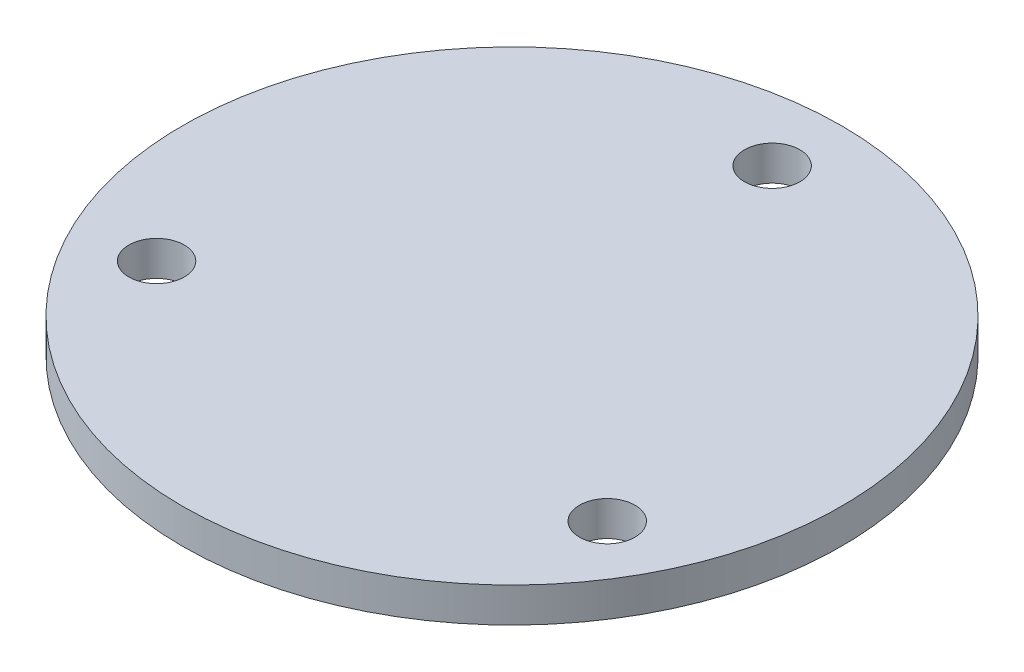
ISO-10303-21;
HEADER;
FILE_DESCRIPTION(('STEP AP214'),'2;1');
FILE_NAME('part.step','',(''),(''),'','','');
FILE_SCHEMA(('AUTOMOTIVE_DESIGN { 1 0 10303 214 1 1 1 1 }'));
ENDSEC;
DATA;
#1=APPLICATION_CONTEXT('core data for automotive mechanical design processes');
#2=APPLICATION_PROTOCOL_DEFINITION('international standard','automotive_design',2000,#1);
#3=PRODUCT_CONTEXT('',#1,'mechanical');
#4=PRODUCT('Part','Part','',(#3));
#5=PRODUCT_RELATED_PRODUCT_CATEGORY('part','',(#4));
#6=PRODUCT_DEFINITION_FORMATION('','',#4);
#7=PRODUCT_DEFINITION_CONTEXT('part definition',#1,'design');
#8=PRODUCT_DEFINITION('design','',#6,#7);
#9=PRODUCT_DEFINITION_SHAPE('','',#8);
#10=(LENGTH_UNIT() NAMED_UNIT(*) SI_UNIT(.MILLI.,.METRE.));
#11=(NAMED_UNIT(*) PLANE_ANGLE_UNIT() SI_UNIT($,.RADIAN.));
#12=(NAMED_UNIT(*) SI_UNIT($,.STERADIAN.) SOLID_ANGLE_UNIT());
#13=UNCERTAINTY_MEASURE_WITH_UNIT(LENGTH_MEASURE(1.E-05),#10,'distance_accuracy_value','');
#14=(GEOMETRIC_REPRESENTATION_CONTEXT(3) GLOBAL_UNCERTAINTY_ASSIGNED_CONTEXT((#13)) GLOBAL_UNIT_ASSIGNED_CONTEXT((#10,
#11,#12)) REPRESENTATION_CONTEXT('',''));
#15=CARTESIAN_POINT('',(0.,0.,0.));
#16=DIRECTION('',(0.,0.,1.));
#17=DIRECTION('',(1.,0.,0.));
#18=AXIS2_PLACEMENT_3D('',#15,#16,#17);
#19=CARTESIAN_POINT('',(0.,2.,0.));
#20=DIRECTION('',(0.,1.,0.));
#21=DIRECTION('',(0.,0.,1.));
#22=AXIS2_PLACEMENT_3D('',#19,#20,#21);
#23=PLANE('',#22);
#24=CARTESIAN_POINT('',(12.9903810567675,2.,7.49999999999945));
#25=DIRECTION('',(0.,1.,0.));
#26=DIRECTION('',(0.,0.,1.));
#27=AXIS2_PLACEMENT_3D('',#24,#25,#26);
#28=CIRCLE('',#27,1.60000000000082);
#29=CARTESIAN_POINT('',(12.9903810567675,2.,9.10000000000027));
#30=VERTEX_POINT('',#29);
#31=EDGE_CURVE('E56',#30,#30,#28,.T.);
#32=ORIENTED_EDGE('',*,*,#31,.F.);
#33=EDGE_LOOP('',(#32));
#34=FACE_BOUND('',#33,.T.);
#35=CARTESIAN_POINT('',(0.,2.,0.));
#36=DIRECTION('',(0.,1.,0.));
#37=DIRECTION('',(0.,0.,1.));
#38=AXIS2_PLACEMENT_3D('',#35,#36,#37);
#39=CIRCLE('',#38,19.);
#40=CARTESIAN_POINT('',(0.,2.,19.));
#41=VERTEX_POINT('',#40);
#42=EDGE_CURVE('E10',#41,#41,#39,.T.);
#43=ORIENTED_EDGE('',*,*,#42,.T.);
#44=EDGE_LOOP('',(#43));
#45=FACE_BOUND('',#44,.T.);
#46=CARTESIAN_POINT('',(0.,2.,-15.));
#47=DIRECTION('',(0.,1.,0.));
#48=DIRECTION('',(0.,0.,1.));
#49=AXIS2_PLACEMENT_3D('',#46,#47,#48);
#50=CIRCLE('',#49,1.6);
#51=CARTESIAN_POINT('',(0.,2.,-13.4));
#52=VERTEX_POINT('',#51);
#53=EDGE_CURVE('E50',#52,#52,#50,.T.);
#54=ORIENTED_EDGE('',*,*,#53,.F.);
#55=EDGE_LOOP('',(#54));
#56=FACE_BOUND('',#55,.T.);
#57=CARTESIAN_POINT('',(-12.9903810567656,2.,7.50000000000056));
#58=DIRECTION('',(0.,1.,0.));
#59=DIRECTION('',(0.,0.,1.));
#60=AXIS2_PLACEMENT_3D('',#57,#58,#59);
#61=CIRCLE('',#60,1.60000000000122);
#62=CARTESIAN_POINT('',(-12.9903810567656,2.,9.10000000000177));
#63=VERTEX_POINT('',#62);
#64=EDGE_CURVE('E64',#63,#63,#61,.T.);
#65=ORIENTED_EDGE('',*,*,#64,.F.);
#66=EDGE_LOOP('',(#65));
#67=FACE_BOUND('',#66,.T.);
#68=ADVANCED_FACE('F37',(#34,#45,#56,#67),#23,.T.);
#69=CARTESIAN_POINT('',(0.,0.,0.));
#70=DIRECTION('',(0.,1.,0.));
#71=DIRECTION('',(0.,0.,1.));
#72=AXIS2_PLACEMENT_3D('',#69,#70,#71);
#73=PLANE('',#72);
#74=CARTESIAN_POINT('',(0.,0.,0.));
#75=DIRECTION('',(0.,1.,0.));
#76=DIRECTION('',(0.,0.,1.));
#77=AXIS2_PLACEMENT_3D('',#74,#75,#76);
#78=CIRCLE('',#77,19.);
#79=CARTESIAN_POINT('',(0.,0.,19.));
#80=VERTEX_POINT('',#79);
#81=EDGE_CURVE('E41',#80,#80,#78,.T.);
#82=ORIENTED_EDGE('',*,*,#81,.F.);
#83=EDGE_LOOP('',(#82));
#84=FACE_BOUND('',#83,.T.);
#85=CARTESIAN_POINT('',(0.,0.,-15.));
#86=DIRECTION('',(0.,1.,0.));
#87=DIRECTION('',(0.,0.,1.));
#88=AXIS2_PLACEMENT_3D('',#85,#86,#87);
#89=CIRCLE('',#88,1.6);
#90=CARTESIAN_POINT('',(0.,0.,-13.4));
#91=VERTEX_POINT('',#90);
#92=EDGE_CURVE('E52',#91,#91,#89,.T.);
#93=ORIENTED_EDGE('',*,*,#92,.T.);
#94=EDGE_LOOP('',(#93));
#95=FACE_BOUND('',#94,.T.);
#96=CARTESIAN_POINT('',(12.9903810567675,0.,7.49999999999945));
#97=DIRECTION('',(0.,1.,0.));
#98=DIRECTION('',(0.,0.,1.));
#99=AXIS2_PLACEMENT_3D('',#96,#97,#98);
#100=CIRCLE('',#99,1.60000000000082);
#101=CARTESIAN_POINT('',(12.9903810567675,0.,9.10000000000027));
#102=VERTEX_POINT('',#101);
#103=EDGE_CURVE('E60',#102,#102,#100,.T.);
#104=ORIENTED_EDGE('',*,*,#103,.T.);
#105=EDGE_LOOP('',(#104));
#106=FACE_BOUND('',#105,.T.);
#107=CARTESIAN_POINT('',(-12.9903810567656,0.,7.50000000000056));
#108=DIRECTION('',(0.,1.,0.));
#109=DIRECTION('',(0.,0.,1.));
#110=AXIS2_PLACEMENT_3D('',#107,#108,#109);
#111=CIRCLE('',#110,1.60000000000122);
#112=CARTESIAN_POINT('',(-12.9903810567656,0.,9.10000000000177));
#113=VERTEX_POINT('',#112);
#114=EDGE_CURVE('E68',#113,#113,#111,.T.);
#115=ORIENTED_EDGE('',*,*,#114,.T.);
#116=EDGE_LOOP('',(#115));
#117=FACE_BOUND('',#116,.T.);
#118=ADVANCED_FACE('F80',(#84,#95,#106,#117),#73,.F.);
#119=CARTESIAN_POINT('',(0.,2.,0.));
#120=DIRECTION('',(0.,-1.,0.));
#121=DIRECTION('',(0.,0.,-1.));
#122=AXIS2_PLACEMENT_3D('',#119,#120,#121);
#123=CYLINDRICAL_SURFACE('',#122,19.);
#124=ORIENTED_EDGE('',*,*,#42,.F.);
#125=EDGE_LOOP('',(#124));
#126=FACE_BOUND('',#125,.T.);
#127=ORIENTED_EDGE('',*,*,#81,.T.);
#128=EDGE_LOOP('',(#127));
#129=FACE_BOUND('',#128,.T.);
#130=ADVANCED_FACE('F39',(#126,#129),#123,.T.);
#131=CARTESIAN_POINT('',(0.,2.,-15.));
#132=DIRECTION('',(0.,-1.,0.));
#133=DIRECTION('',(0.,0.,-1.));
#134=AXIS2_PLACEMENT_3D('',#131,#132,#133);
#135=CYLINDRICAL_SURFACE('',#134,1.6);
#136=ORIENTED_EDGE('',*,*,#53,.T.);
#137=EDGE_LOOP('',(#136));
#138=FACE_BOUND('',#137,.T.);
#139=ORIENTED_EDGE('',*,*,#92,.F.);
#140=EDGE_LOOP('',(#139));
#141=FACE_BOUND('',#140,.T.);
#142=ADVANCED_FACE('F89',(#138,#141),#135,.F.);
#143=CARTESIAN_POINT('',(12.9903810567675,2.,7.49999999999945));
#144=DIRECTION('',(0.,-1.,0.));
#145=DIRECTION('',(0.,0.,-1.));
#146=AXIS2_PLACEMENT_3D('',#143,#144,#145);
#147=CYLINDRICAL_SURFACE('',#146,1.60000000000082);
#148=ORIENTED_EDGE('',*,*,#31,.T.);
#149=EDGE_LOOP('',(#148));
#150=FACE_BOUND('',#149,.T.);
#151=ORIENTED_EDGE('',*,*,#103,.F.);
#152=EDGE_LOOP('',(#151));
#153=FACE_BOUND('',#152,.T.);
#154=ADVANCED_FACE('F92',(#150,#153),#147,.F.);
#155=CARTESIAN_POINT('',(-12.9903810567656,2.,7.50000000000056));
#156=DIRECTION('',(0.,-1.,0.));
#157=DIRECTION('',(0.,0.,-1.));
#158=AXIS2_PLACEMENT_3D('',#155,#156,#157);
#159=CYLINDRICAL_SURFACE('',#158,1.60000000000122);
#160=ORIENTED_EDGE('',*,*,#64,.T.);
#161=EDGE_LOOP('',(#160));
#162=FACE_BOUND('',#161,.T.);
#163=ORIENTED_EDGE('',*,*,#114,.F.);
#164=EDGE_LOOP('',(#163));
#165=FACE_BOUND('',#164,.T.);
#166=ADVANCED_FACE('F76',(#162,#165),#159,.F.);
#167=CLOSED_SHELL('',(#68,#118,#130,#142,#154,#166));
#168=MANIFOLD_SOLID_BREP('B2',#167);
#169=ADVANCED_BREP_SHAPE_REPRESENTATION('',(#18,#168),#14);
#170=SHAPE_DEFINITION_REPRESENTATION(#9,#169);
ENDSEC;
END-ISO-10303-21;
